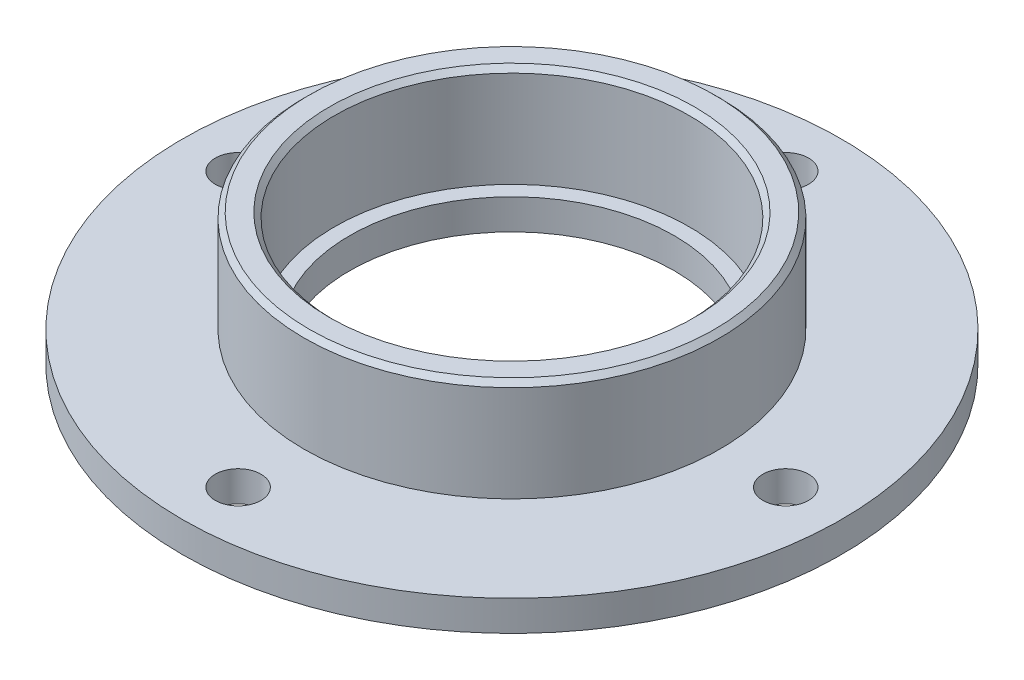
ISO-10303-21;
HEADER;
FILE_DESCRIPTION(('STEP AP214'),'2;1');
FILE_NAME('part.step','',(''),(''),'','','');
FILE_SCHEMA(('AUTOMOTIVE_DESIGN { 1 0 10303 214 1 1 1 1 }'));
ENDSEC;
DATA;
#1=APPLICATION_CONTEXT('core data for automotive mechanical design processes');
#2=APPLICATION_PROTOCOL_DEFINITION('international standard','automotive_design',2000,#1);
#3=PRODUCT_CONTEXT('',#1,'mechanical');
#4=PRODUCT('Part','Part','',(#3));
#5=PRODUCT_RELATED_PRODUCT_CATEGORY('part','',(#4));
#6=PRODUCT_DEFINITION_FORMATION('','',#4);
#7=PRODUCT_DEFINITION_CONTEXT('part definition',#1,'design');
#8=PRODUCT_DEFINITION('design','',#6,#7);
#9=PRODUCT_DEFINITION_SHAPE('','',#8);
#10=(LENGTH_UNIT() NAMED_UNIT(*) SI_UNIT(.MILLI.,.METRE.));
#11=(NAMED_UNIT(*) PLANE_ANGLE_UNIT() SI_UNIT($,.RADIAN.));
#12=(NAMED_UNIT(*) SI_UNIT($,.STERADIAN.) SOLID_ANGLE_UNIT());
#13=UNCERTAINTY_MEASURE_WITH_UNIT(LENGTH_MEASURE(1.E-05),#10,'distance_accuracy_value','');
#14=(GEOMETRIC_REPRESENTATION_CONTEXT(3) GLOBAL_UNCERTAINTY_ASSIGNED_CONTEXT((#13)) GLOBAL_UNIT_ASSIGNED_CONTEXT((#10,
#11,#12)) REPRESENTATION_CONTEXT('',''));
#15=CARTESIAN_POINT('',(0.,0.,0.));
#16=DIRECTION('',(0.,0.,1.));
#17=DIRECTION('',(1.,0.,0.));
#18=AXIS2_PLACEMENT_3D('',#15,#16,#17);
#19=CARTESIAN_POINT('',(0.,3.,0.));
#20=DIRECTION('',(0.,1.,0.));
#21=DIRECTION('',(0.,0.,1.));
#22=AXIS2_PLACEMENT_3D('',#19,#20,#21);
#23=PLANE('',#22);
#24=CARTESIAN_POINT('',(0.,3.,0.));
#25=DIRECTION('',(0.,1.,0.));
#26=DIRECTION('',(0.,0.,1.));
#27=AXIS2_PLACEMENT_3D('',#24,#25,#26);
#28=CIRCLE('',#27,16.);
#29=CARTESIAN_POINT('',(0.,3.,16.));
#30=VERTEX_POINT('',#29);
#31=EDGE_CURVE('E78',#30,#30,#28,.T.);
#32=ORIENTED_EDGE('',*,*,#31,.F.);
#33=EDGE_LOOP('',(#32));
#34=FACE_BOUND('',#33,.T.);
#35=CARTESIAN_POINT('',(0.,3.,0.));
#36=DIRECTION('',(0.,1.,0.));
#37=DIRECTION('',(0.,0.,1.));
#38=AXIS2_PLACEMENT_3D('',#35,#36,#37);
#39=CIRCLE('',#38,17.5);
#40=CARTESIAN_POINT('',(0.,3.,17.5));
#41=VERTEX_POINT('',#40);
#42=EDGE_CURVE('E72',#41,#41,#39,.T.);
#43=ORIENTED_EDGE('',*,*,#42,.T.);
#44=EDGE_LOOP('',(#43));
#45=FACE_BOUND('',#44,.T.);
#46=ADVANCED_FACE('F42',(#34,#45),#23,.T.);
#47=CARTESIAN_POINT('',(0.,3.,-27.));
#48=DIRECTION('',(0.,1.,0.));
#49=DIRECTION('',(0.,0.,1.));
#50=AXIS2_PLACEMENT_3D('',#47,#48,#49);
#51=CIRCLE('',#50,2.24999999999999);
#52=CARTESIAN_POINT('',(0.,3.,-24.75));
#53=VERTEX_POINT('',#52);
#54=EDGE_CURVE('E102',#53,#53,#51,.T.);
#55=ORIENTED_EDGE('',*,*,#54,.F.);
#56=EDGE_LOOP('',(#55));
#57=FACE_BOUND('',#56,.T.);
#58=CARTESIAN_POINT('',(27.,3.,0.));
#59=DIRECTION('',(0.,1.,0.));
#60=DIRECTION('',(0.,0.,1.));
#61=AXIS2_PLACEMENT_3D('',#58,#59,#60);
#62=CIRCLE('',#61,2.24999999999999);
#63=CARTESIAN_POINT('',(27.,3.,2.24999999999999));
#64=VERTEX_POINT('',#63);
#65=EDGE_CURVE('E68',#64,#64,#62,.T.);
#66=ORIENTED_EDGE('',*,*,#65,.F.);
#67=EDGE_LOOP('',(#66));
#68=FACE_BOUND('',#67,.T.);
#69=CARTESIAN_POINT('',(0.,3.,27.));
#70=DIRECTION('',(0.,1.,0.));
#71=DIRECTION('',(0.,0.,1.));
#72=AXIS2_PLACEMENT_3D('',#69,#70,#71);
#73=CIRCLE('',#72,2.24999999999999);
#74=CARTESIAN_POINT('',(0.,3.,29.25));
#75=VERTEX_POINT('',#74);
#76=EDGE_CURVE('E67',#75,#75,#73,.T.);
#77=ORIENTED_EDGE('',*,*,#76,.F.);
#78=EDGE_LOOP('',(#77));
#79=FACE_BOUND('',#78,.T.);
#80=CARTESIAN_POINT('',(-27.,3.,0.));
#81=DIRECTION('',(0.,1.,0.));
#82=DIRECTION('',(0.,0.,1.));
#83=AXIS2_PLACEMENT_3D('',#80,#81,#82);
#84=CIRCLE('',#83,2.24999999999999);
#85=CARTESIAN_POINT('',(-27.,3.,2.24999999999999));
#86=VERTEX_POINT('',#85);
#87=EDGE_CURVE('E73',#86,#86,#84,.T.);
#88=ORIENTED_EDGE('',*,*,#87,.F.);
#89=EDGE_LOOP('',(#88));
#90=FACE_BOUND('',#89,.T.);
#91=CARTESIAN_POINT('',(0.,3.,0.));
#92=DIRECTION('',(0.,1.,0.));
#93=DIRECTION('',(0.,0.,1.));
#94=AXIS2_PLACEMENT_3D('',#91,#92,#93);
#95=CIRCLE('',#94,20.5);
#96=CARTESIAN_POINT('',(0.,3.,20.5));
#97=VERTEX_POINT('',#96);
#98=EDGE_CURVE('E63',#97,#97,#95,.T.);
#99=ORIENTED_EDGE('',*,*,#98,.F.);
#100=EDGE_LOOP('',(#99));
#101=FACE_BOUND('',#100,.T.);
#102=CARTESIAN_POINT('',(0.,3.,0.));
#103=DIRECTION('',(0.,1.,0.));
#104=DIRECTION('',(0.,0.,1.));
#105=AXIS2_PLACEMENT_3D('',#102,#103,#104);
#106=CIRCLE('',#105,32.5);
#107=CARTESIAN_POINT('',(0.,3.,32.5));
#108=VERTEX_POINT('',#107);
#109=EDGE_CURVE('E77',#108,#108,#106,.T.);
#110=ORIENTED_EDGE('',*,*,#109,.T.);
#111=EDGE_LOOP('',(#110));
#112=FACE_BOUND('',#111,.T.);
#113=ADVANCED_FACE('F109',(#57,#68,#79,#90,#101,#112),#23,.T.);
#114=CARTESIAN_POINT('',(0.,0.,0.));
#115=DIRECTION('',(0.,1.,0.));
#116=DIRECTION('',(0.,0.,1.));
#117=AXIS2_PLACEMENT_3D('',#114,#115,#116);
#118=PLANE('',#117);
#119=CARTESIAN_POINT('',(0.,0.,-27.));
#120=DIRECTION('',(0.,1.,0.));
#121=DIRECTION('',(0.,0.,1.));
#122=AXIS2_PLACEMENT_3D('',#119,#120,#121);
#123=CIRCLE('',#122,2.24999999999999);
#124=CARTESIAN_POINT('',(0.,0.,-24.75));
#125=VERTEX_POINT('',#124);
#126=EDGE_CURVE('E99',#125,#125,#123,.T.);
#127=ORIENTED_EDGE('',*,*,#126,.T.);
#128=EDGE_LOOP('',(#127));
#129=FACE_BOUND('',#128,.T.);
#130=CARTESIAN_POINT('',(27.,0.,0.));
#131=DIRECTION('',(0.,1.,0.));
#132=DIRECTION('',(0.,0.,1.));
#133=AXIS2_PLACEMENT_3D('',#130,#131,#132);
#134=CIRCLE('',#133,2.24999999999999);
#135=CARTESIAN_POINT('',(27.,0.,2.24999999999999));
#136=VERTEX_POINT('',#135);
#137=EDGE_CURVE('E64',#136,#136,#134,.T.);
#138=ORIENTED_EDGE('',*,*,#137,.T.);
#139=EDGE_LOOP('',(#138));
#140=FACE_BOUND('',#139,.T.);
#141=CARTESIAN_POINT('',(0.,0.,27.));
#142=DIRECTION('',(0.,1.,0.));
#143=DIRECTION('',(0.,0.,1.));
#144=AXIS2_PLACEMENT_3D('',#141,#142,#143);
#145=CIRCLE('',#144,2.24999999999999);
#146=CARTESIAN_POINT('',(0.,0.,29.25));
#147=VERTEX_POINT('',#146);
#148=EDGE_CURVE('E92',#147,#147,#145,.T.);
#149=ORIENTED_EDGE('',*,*,#148,.T.);
#150=EDGE_LOOP('',(#149));
#151=FACE_BOUND('',#150,.T.);
#152=CARTESIAN_POINT('',(-27.,0.,0.));
#153=DIRECTION('',(0.,1.,0.));
#154=DIRECTION('',(0.,0.,1.));
#155=AXIS2_PLACEMENT_3D('',#152,#153,#154);
#156=CIRCLE('',#155,2.24999999999999);
#157=CARTESIAN_POINT('',(-27.,0.,2.24999999999999));
#158=VERTEX_POINT('',#157);
#159=EDGE_CURVE('E69',#158,#158,#156,.T.);
#160=ORIENTED_EDGE('',*,*,#159,.T.);
#161=EDGE_LOOP('',(#160));
#162=FACE_BOUND('',#161,.T.);
#163=CARTESIAN_POINT('',(0.,0.,0.));
#164=DIRECTION('',(0.,1.,0.));
#165=DIRECTION('',(0.,0.,1.));
#166=AXIS2_PLACEMENT_3D('',#163,#164,#165);
#167=CIRCLE('',#166,32.5);
#168=CARTESIAN_POINT('',(0.,0.,32.5));
#169=VERTEX_POINT('',#168);
#170=EDGE_CURVE('E74',#169,#169,#167,.T.);
#171=ORIENTED_EDGE('',*,*,#170,.F.);
#172=EDGE_LOOP('',(#171));
#173=FACE_BOUND('',#172,.T.);
#174=CARTESIAN_POINT('',(0.,0.,0.));
#175=DIRECTION('',(0.,1.,0.));
#176=DIRECTION('',(0.,0.,1.));
#177=AXIS2_PLACEMENT_3D('',#174,#175,#176);
#178=CIRCLE('',#177,16.);
#179=CARTESIAN_POINT('',(0.,0.,16.));
#180=VERTEX_POINT('',#179);
#181=EDGE_CURVE('E81',#180,#180,#178,.T.);
#182=ORIENTED_EDGE('',*,*,#181,.T.);
#183=EDGE_LOOP('',(#182));
#184=FACE_BOUND('',#183,.T.);
#185=ADVANCED_FACE('F112',(#129,#140,#151,#162,#173,#184),#118,.F.);
#186=CARTESIAN_POINT('',(0.,3.,0.));
#187=DIRECTION('',(0.,-1.,0.));
#188=DIRECTION('',(0.,0.,-1.));
#189=AXIS2_PLACEMENT_3D('',#186,#187,#188);
#190=CYLINDRICAL_SURFACE('',#189,32.5);
#191=ORIENTED_EDGE('',*,*,#109,.F.);
#192=EDGE_LOOP('',(#191));
#193=FACE_BOUND('',#192,.T.);
#194=ORIENTED_EDGE('',*,*,#170,.T.);
#195=EDGE_LOOP('',(#194));
#196=FACE_BOUND('',#195,.T.);
#197=ADVANCED_FACE('F124',(#193,#196),#190,.T.);
#198=CARTESIAN_POINT('',(0.,3.,0.));
#199=DIRECTION('',(0.,-1.,0.));
#200=DIRECTION('',(0.,0.,-1.));
#201=AXIS2_PLACEMENT_3D('',#198,#199,#200);
#202=CYLINDRICAL_SURFACE('',#201,16.);
#203=ORIENTED_EDGE('',*,*,#31,.T.);
#204=EDGE_LOOP('',(#203));
#205=FACE_BOUND('',#204,.T.);
#206=ORIENTED_EDGE('',*,*,#181,.F.);
#207=EDGE_LOOP('',(#206));
#208=FACE_BOUND('',#207,.T.);
#209=ADVANCED_FACE('F127',(#205,#208),#202,.F.);
#210=CARTESIAN_POINT('',(0.,13.,0.));
#211=DIRECTION('',(0.,1.,0.));
#212=DIRECTION('',(0.,0.,1.));
#213=AXIS2_PLACEMENT_3D('',#210,#211,#212);
#214=PLANE('',#213);
#215=CARTESIAN_POINT('',(0.,13.,0.));
#216=DIRECTION('',(0.,1.,0.));
#217=DIRECTION('',(0.,0.,1.));
#218=AXIS2_PLACEMENT_3D('',#215,#216,#217);
#219=CIRCLE('',#218,20.);
#220=CARTESIAN_POINT('',(0.,13.,20.));
#221=VERTEX_POINT('',#220);
#222=EDGE_CURVE('E54',#221,#221,#219,.T.);
#223=ORIENTED_EDGE('',*,*,#222,.T.);
#224=EDGE_LOOP('',(#223));
#225=FACE_BOUND('',#224,.T.);
#226=CARTESIAN_POINT('',(0.,13.,0.));
#227=DIRECTION('',(0.,1.,0.));
#228=DIRECTION('',(0.,0.,1.));
#229=AXIS2_PLACEMENT_3D('',#226,#227,#228);
#230=CIRCLE('',#229,18.);
#231=CARTESIAN_POINT('',(0.,13.,18.));
#232=VERTEX_POINT('',#231);
#233=EDGE_CURVE('E58',#232,#232,#230,.F.);
#234=ORIENTED_EDGE('',*,*,#233,.T.);
#235=EDGE_LOOP('',(#234));
#236=FACE_BOUND('',#235,.T.);
#237=ADVANCED_FACE('F138',(#225,#236),#214,.T.);
#238=CARTESIAN_POINT('',(0.,13.,0.));
#239=DIRECTION('',(0.,-1.,0.));
#240=DIRECTION('',(0.,0.,-1.));
#241=AXIS2_PLACEMENT_3D('',#238,#239,#240);
#242=CYLINDRICAL_SURFACE('',#241,20.5);
#243=CARTESIAN_POINT('',(0.,12.5,0.));
#244=DIRECTION('',(0.,1.,0.));
#245=DIRECTION('',(0.,0.,1.));
#246=AXIS2_PLACEMENT_3D('',#243,#244,#245);
#247=CIRCLE('',#246,20.5);
#248=CARTESIAN_POINT('',(0.,12.5,20.5));
#249=VERTEX_POINT('',#248);
#250=EDGE_CURVE('E50',#249,#249,#247,.F.);
#251=ORIENTED_EDGE('',*,*,#250,.T.);
#252=EDGE_LOOP('',(#251));
#253=FACE_BOUND('',#252,.T.);
#254=ORIENTED_EDGE('',*,*,#98,.T.);
#255=EDGE_LOOP('',(#254));
#256=FACE_BOUND('',#255,.T.);
#257=ADVANCED_FACE('F145',(#253,#256),#242,.T.);
#258=CARTESIAN_POINT('',(0.,13.,0.));
#259=DIRECTION('',(0.,-1.,0.));
#260=DIRECTION('',(0.,0.,-1.));
#261=AXIS2_PLACEMENT_3D('',#258,#259,#260);
#262=CYLINDRICAL_SURFACE('',#261,17.5);
#263=CARTESIAN_POINT('',(0.,12.5,0.));
#264=DIRECTION('',(0.,1.,0.));
#265=DIRECTION('',(0.,0.,1.));
#266=AXIS2_PLACEMENT_3D('',#263,#264,#265);
#267=CIRCLE('',#266,17.5);
#268=CARTESIAN_POINT('',(0.,12.5,17.5));
#269=VERTEX_POINT('',#268);
#270=EDGE_CURVE('E10',#269,#269,#267,.T.);
#271=ORIENTED_EDGE('',*,*,#270,.T.);
#272=EDGE_LOOP('',(#271));
#273=FACE_BOUND('',#272,.T.);
#274=ORIENTED_EDGE('',*,*,#42,.F.);
#275=EDGE_LOOP('',(#274));
#276=FACE_BOUND('',#275,.T.);
#277=ADVANCED_FACE('F186',(#273,#276),#262,.F.);
#278=CARTESIAN_POINT('',(-27.,3.,0.));
#279=DIRECTION('',(0.,1.,0.));
#280=DIRECTION('',(0.,0.,1.));
#281=AXIS2_PLACEMENT_3D('',#278,#279,#280);
#282=CYLINDRICAL_SURFACE('',#281,2.24999999999999);
#283=ORIENTED_EDGE('',*,*,#87,.T.);
#284=EDGE_LOOP('',(#283));
#285=FACE_BOUND('',#284,.T.);
#286=ORIENTED_EDGE('',*,*,#159,.F.);
#287=EDGE_LOOP('',(#286));
#288=FACE_BOUND('',#287,.T.);
#289=ADVANCED_FACE('F182',(#285,#288),#282,.F.);
#290=CARTESIAN_POINT('',(0.,3.,27.));
#291=DIRECTION('',(0.,1.,0.));
#292=DIRECTION('',(0.,0.,1.));
#293=AXIS2_PLACEMENT_3D('',#290,#291,#292);
#294=CYLINDRICAL_SURFACE('',#293,2.24999999999999);
#295=ORIENTED_EDGE('',*,*,#76,.T.);
#296=EDGE_LOOP('',(#295));
#297=FACE_BOUND('',#296,.T.);
#298=ORIENTED_EDGE('',*,*,#148,.F.);
#299=EDGE_LOOP('',(#298));
#300=FACE_BOUND('',#299,.T.);
#301=ADVANCED_FACE('F176',(#297,#300),#294,.F.);
#302=CARTESIAN_POINT('',(27.,3.,0.));
#303=DIRECTION('',(0.,1.,0.));
#304=DIRECTION('',(0.,0.,1.));
#305=AXIS2_PLACEMENT_3D('',#302,#303,#304);
#306=CYLINDRICAL_SURFACE('',#305,2.24999999999999);
#307=ORIENTED_EDGE('',*,*,#65,.T.);
#308=EDGE_LOOP('',(#307));
#309=FACE_BOUND('',#308,.T.);
#310=ORIENTED_EDGE('',*,*,#137,.F.);
#311=EDGE_LOOP('',(#310));
#312=FACE_BOUND('',#311,.T.);
#313=ADVANCED_FACE('F166',(#309,#312),#306,.F.);
#314=CARTESIAN_POINT('',(0.,3.,-27.));
#315=DIRECTION('',(0.,1.,0.));
#316=DIRECTION('',(0.,0.,1.));
#317=AXIS2_PLACEMENT_3D('',#314,#315,#316);
#318=CYLINDRICAL_SURFACE('',#317,2.24999999999999);
#319=ORIENTED_EDGE('',*,*,#54,.T.);
#320=EDGE_LOOP('',(#319));
#321=FACE_BOUND('',#320,.T.);
#322=ORIENTED_EDGE('',*,*,#126,.F.);
#323=EDGE_LOOP('',(#322));
#324=FACE_BOUND('',#323,.T.);
#325=ADVANCED_FACE('F106',(#321,#324),#318,.F.);
#326=CARTESIAN_POINT('',(0.,13.,0.));
#327=DIRECTION('',(0.,-1.,0.));
#328=DIRECTION('',(0.,0.,-1.));
#329=AXIS2_PLACEMENT_3D('',#326,#327,#328);
#330=CONICAL_SURFACE('',#329,20.,0.785398163397445);
#331=ORIENTED_EDGE('',*,*,#250,.F.);
#332=EDGE_LOOP('',(#331));
#333=FACE_BOUND('',#332,.T.);
#334=ORIENTED_EDGE('',*,*,#222,.F.);
#335=EDGE_LOOP('',(#334));
#336=FACE_BOUND('',#335,.T.);
#337=ADVANCED_FACE('F155',(#333,#336),#330,.T.);
#338=CARTESIAN_POINT('',(0.,12.5,0.));
#339=DIRECTION('',(0.,1.,0.));
#340=DIRECTION('',(0.,0.,1.));
#341=AXIS2_PLACEMENT_3D('',#338,#339,#340);
#342=CONICAL_SURFACE('',#341,17.5,0.785398163397431);
#343=ORIENTED_EDGE('',*,*,#233,.F.);
#344=EDGE_LOOP('',(#343));
#345=FACE_BOUND('',#344,.T.);
#346=ORIENTED_EDGE('',*,*,#270,.F.);
#347=EDGE_LOOP('',(#346));
#348=FACE_BOUND('',#347,.T.);
#349=ADVANCED_FACE('F45',(#345,#348),#342,.F.);
#350=CLOSED_SHELL('',(#46,#113,#185,#197,#209,#237,#257,#277,#289,#301,#313,#325,#337,#349));
#351=MANIFOLD_SOLID_BREP('B2',#350);
#352=ADVANCED_BREP_SHAPE_REPRESENTATION('',(#18,#351),#14);
#353=SHAPE_DEFINITION_REPRESENTATION(#9,#352);
ENDSEC;
END-ISO-10303-21;
